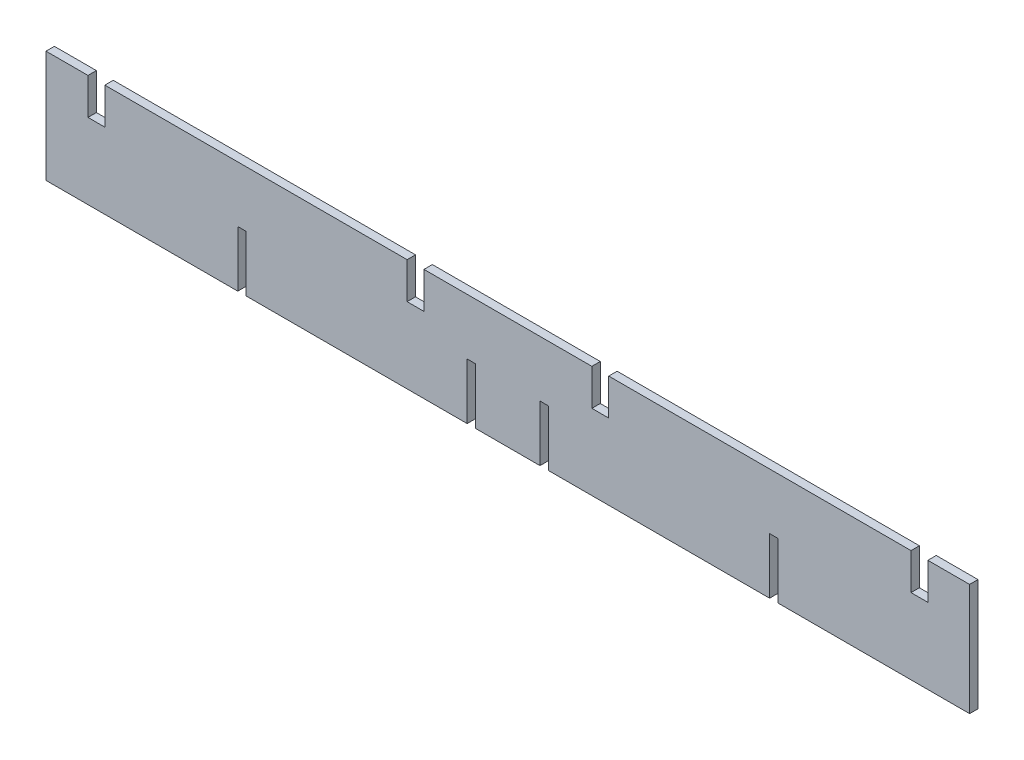
ISO-10303-21;
HEADER;
FILE_DESCRIPTION(('STEP AP214'),'2;1');
FILE_NAME('part.step','',(''),(''),'','','');
FILE_SCHEMA(('AUTOMOTIVE_DESIGN { 1 0 10303 214 1 1 1 1 }'));
ENDSEC;
DATA;
#1=APPLICATION_CONTEXT('core data for automotive mechanical design processes');
#2=APPLICATION_PROTOCOL_DEFINITION('international standard','automotive_design',2000,#1);
#3=PRODUCT_CONTEXT('',#1,'mechanical');
#4=PRODUCT('Part','Part','',(#3));
#5=PRODUCT_RELATED_PRODUCT_CATEGORY('part','',(#4));
#6=PRODUCT_DEFINITION_FORMATION('','',#4);
#7=PRODUCT_DEFINITION_CONTEXT('part definition',#1,'design');
#8=PRODUCT_DEFINITION('design','',#6,#7);
#9=PRODUCT_DEFINITION_SHAPE('','',#8);
#10=(LENGTH_UNIT() NAMED_UNIT(*) SI_UNIT(.MILLI.,.METRE.));
#11=(NAMED_UNIT(*) PLANE_ANGLE_UNIT() SI_UNIT($,.RADIAN.));
#12=(NAMED_UNIT(*) SI_UNIT($,.STERADIAN.) SOLID_ANGLE_UNIT());
#13=UNCERTAINTY_MEASURE_WITH_UNIT(LENGTH_MEASURE(1.E-05),#10,'distance_accuracy_value','');
#14=(GEOMETRIC_REPRESENTATION_CONTEXT(3) GLOBAL_UNCERTAINTY_ASSIGNED_CONTEXT((#13)) GLOBAL_UNIT_ASSIGNED_CONTEXT((#10,
#11,#12)) REPRESENTATION_CONTEXT('',''));
#15=CARTESIAN_POINT('',(0.,0.,0.));
#16=DIRECTION('',(0.,0.,1.));
#17=DIRECTION('',(1.,0.,0.));
#18=AXIS2_PLACEMENT_3D('',#15,#16,#17);
#19=CARTESIAN_POINT('',(-330.,-40.,6.));
#20=DIRECTION('',(0.,1.,0.));
#21=DIRECTION('',(0.,0.,1.));
#22=AXIS2_PLACEMENT_3D('',#19,#20,#21);
#23=PLANE('',#22);
#24=DIRECTION('',(1.,0.,0.));
#25=VECTOR('',#24,1.);
#26=CARTESIAN_POINT('',(-330.,-40.,6.));
#27=LINE('',#26,#25);
#28=CARTESIAN_POINT('',(193.12,-40.,6.));
#29=VERTEX_POINT('',#28);
#30=CARTESIAN_POINT('',(330.,-40.,6.));
#31=VERTEX_POINT('',#30);
#32=EDGE_CURVE('E495',#29,#31,#27,.T.);
#33=ORIENTED_EDGE('',*,*,#32,.F.);
#34=DIRECTION('',(0.,0.,1.));
#35=VECTOR('',#34,1.);
#36=CARTESIAN_POINT('',(193.12,-40.,0.));
#37=LINE('',#36,#35);
#38=CARTESIAN_POINT('',(193.12,-40.,0.));
#39=VERTEX_POINT('',#38);
#40=EDGE_CURVE('E296',#39,#29,#37,.T.);
#41=ORIENTED_EDGE('',*,*,#40,.F.);
#42=DIRECTION('',(1.,0.,0.));
#43=VECTOR('',#42,1.);
#44=CARTESIAN_POINT('',(-330.,-40.,0.));
#45=LINE('',#44,#43);
#46=CARTESIAN_POINT('',(330.,-40.,0.));
#47=VERTEX_POINT('',#46);
#48=EDGE_CURVE('E511',#39,#47,#45,.T.);
#49=ORIENTED_EDGE('',*,*,#48,.T.);
#50=DIRECTION('',(0.,0.,-1.));
#51=VECTOR('',#50,1.);
#52=CARTESIAN_POINT('',(330.,-40.,6.));
#53=LINE('',#52,#51);
#54=EDGE_CURVE('E499',#31,#47,#53,.T.);
#55=ORIENTED_EDGE('',*,*,#54,.F.);
#56=EDGE_LOOP('',(#33,#41,#49,#55));
#57=FACE_BOUND('',#56,.T.);
#58=ADVANCED_FACE('F35',(#57),#23,.F.);
#59=CARTESIAN_POINT('',(-186.92,-40.,6.));
#60=VERTEX_POINT('',#59);
#61=CARTESIAN_POINT('',(-29.04,-40.,6.));
#62=VERTEX_POINT('',#61);
#63=EDGE_CURVE('E500',#60,#62,#27,.T.);
#64=ORIENTED_EDGE('',*,*,#63,.F.);
#65=DIRECTION('',(0.,0.,1.));
#66=VECTOR('',#65,1.);
#67=CARTESIAN_POINT('',(-186.92,-40.,0.));
#68=LINE('',#67,#66);
#69=CARTESIAN_POINT('',(-186.92,-40.,0.));
#70=VERTEX_POINT('',#69);
#71=EDGE_CURVE('E298',#70,#60,#68,.T.);
#72=ORIENTED_EDGE('',*,*,#71,.F.);
#73=CARTESIAN_POINT('',(-29.04,-40.,0.));
#74=VERTEX_POINT('',#73);
#75=EDGE_CURVE('E288',#70,#74,#45,.T.);
#76=ORIENTED_EDGE('',*,*,#75,.T.);
#77=DIRECTION('',(0.,0.,1.));
#78=VECTOR('',#77,1.);
#79=CARTESIAN_POINT('',(-29.04,-40.,0.));
#80=LINE('',#79,#78);
#81=EDGE_CURVE('E350',#74,#62,#80,.T.);
#82=ORIENTED_EDGE('',*,*,#81,.T.);
#83=EDGE_LOOP('',(#64,#72,#76,#82));
#84=FACE_BOUND('',#83,.T.);
#85=ADVANCED_FACE('F605',(#84),#23,.F.);
#86=CARTESIAN_POINT('',(-23.,-40.,6.));
#87=VERTEX_POINT('',#86);
#88=CARTESIAN_POINT('',(23.,-40.,6.));
#89=VERTEX_POINT('',#88);
#90=EDGE_CURVE('E501',#87,#89,#27,.T.);
#91=ORIENTED_EDGE('',*,*,#90,.F.);
#92=DIRECTION('',(0.,0.,1.));
#93=VECTOR('',#92,1.);
#94=CARTESIAN_POINT('',(-23.,-40.,0.));
#95=LINE('',#94,#93);
#96=CARTESIAN_POINT('',(-23.,-40.,0.));
#97=VERTEX_POINT('',#96);
#98=EDGE_CURVE('E347',#97,#87,#95,.T.);
#99=ORIENTED_EDGE('',*,*,#98,.F.);
#100=CARTESIAN_POINT('',(23.,-40.,0.));
#101=VERTEX_POINT('',#100);
#102=EDGE_CURVE('E514',#97,#101,#45,.T.);
#103=ORIENTED_EDGE('',*,*,#102,.T.);
#104=DIRECTION('',(0.,0.,1.));
#105=VECTOR('',#104,1.);
#106=CARTESIAN_POINT('',(23.,-40.,0.));
#107=LINE('',#106,#105);
#108=EDGE_CURVE('E374',#101,#89,#107,.T.);
#109=ORIENTED_EDGE('',*,*,#108,.T.);
#110=EDGE_LOOP('',(#91,#99,#103,#109));
#111=FACE_BOUND('',#110,.T.);
#112=ADVANCED_FACE('F611',(#111),#23,.F.);
#113=CARTESIAN_POINT('',(29.04,-40.,0.));
#114=VERTEX_POINT('',#113);
#115=CARTESIAN_POINT('',(187.08,-40.,0.));
#116=VERTEX_POINT('',#115);
#117=EDGE_CURVE('E630',#114,#116,#45,.T.);
#118=ORIENTED_EDGE('',*,*,#117,.T.);
#119=DIRECTION('',(0.,0.,1.));
#120=VECTOR('',#119,1.);
#121=CARTESIAN_POINT('',(187.08,-40.,0.));
#122=LINE('',#121,#120);
#123=CARTESIAN_POINT('',(187.08,-40.,6.));
#124=VERTEX_POINT('',#123);
#125=EDGE_CURVE('E322',#116,#124,#122,.T.);
#126=ORIENTED_EDGE('',*,*,#125,.T.);
#127=CARTESIAN_POINT('',(29.04,-40.,6.));
#128=VERTEX_POINT('',#127);
#129=EDGE_CURVE('E647',#128,#124,#27,.T.);
#130=ORIENTED_EDGE('',*,*,#129,.F.);
#131=DIRECTION('',(0.,0.,1.));
#132=VECTOR('',#131,1.);
#133=CARTESIAN_POINT('',(29.04,-40.,0.));
#134=LINE('',#133,#132);
#135=EDGE_CURVE('E342',#114,#128,#134,.T.);
#136=ORIENTED_EDGE('',*,*,#135,.F.);
#137=EDGE_LOOP('',(#118,#126,#130,#136));
#138=FACE_BOUND('',#137,.T.);
#139=ADVANCED_FACE('F601',(#138),#23,.F.);
#140=CARTESIAN_POINT('',(-330.,40.,6.));
#141=DIRECTION('',(0.,-1.,0.));
#142=DIRECTION('',(0.,0.,-1.));
#143=AXIS2_PLACEMENT_3D('',#140,#141,#142);
#144=PLANE('',#143);
#145=DIRECTION('',(-1.,0.,0.));
#146=VECTOR('',#145,1.);
#147=CARTESIAN_POINT('',(-330.,40.,0.));
#148=LINE('',#147,#146);
#149=CARTESIAN_POINT('',(-71.9600000000001,40.,0.));
#150=VERTEX_POINT('',#149);
#151=CARTESIAN_POINT('',(-287.96,40.,0.));
#152=VERTEX_POINT('',#151);
#153=EDGE_CURVE('E586',#150,#152,#148,.T.);
#154=ORIENTED_EDGE('',*,*,#153,.T.);
#155=DIRECTION('',(0.,0.,1.));
#156=VECTOR('',#155,1.);
#157=CARTESIAN_POINT('',(-287.96,40.,0.));
#158=LINE('',#157,#156);
#159=CARTESIAN_POINT('',(-287.96,40.,6.));
#160=VERTEX_POINT('',#159);
#161=EDGE_CURVE('E399',#152,#160,#158,.T.);
#162=ORIENTED_EDGE('',*,*,#161,.T.);
#163=DIRECTION('',(-1.,0.,0.));
#164=VECTOR('',#163,1.);
#165=CARTESIAN_POINT('',(-330.,40.,6.));
#166=LINE('',#165,#164);
#167=CARTESIAN_POINT('',(-71.9600000000001,40.,6.));
#168=VERTEX_POINT('',#167);
#169=EDGE_CURVE('E539',#168,#160,#166,.T.);
#170=ORIENTED_EDGE('',*,*,#169,.F.);
#171=DIRECTION('',(0.,0.,1.));
#172=VECTOR('',#171,1.);
#173=CARTESIAN_POINT('',(-71.9600000000001,40.,0.));
#174=LINE('',#173,#172);
#175=EDGE_CURVE('E395',#150,#168,#174,.T.);
#176=ORIENTED_EDGE('',*,*,#175,.F.);
#177=EDGE_LOOP('',(#154,#162,#170,#176));
#178=FACE_BOUND('',#177,.T.);
#179=ADVANCED_FACE('F585',(#178),#144,.F.);
#180=CARTESIAN_POINT('',(-300.,40.,6.));
#181=VERTEX_POINT('',#180);
#182=CARTESIAN_POINT('',(-330.,40.,6.));
#183=VERTEX_POINT('',#182);
#184=EDGE_CURVE('E487',#181,#183,#166,.T.);
#185=ORIENTED_EDGE('',*,*,#184,.F.);
#186=DIRECTION('',(0.,0.,1.));
#187=VECTOR('',#186,1.);
#188=CARTESIAN_POINT('',(-300.,40.,0.));
#189=LINE('',#188,#187);
#190=CARTESIAN_POINT('',(-300.,40.,0.));
#191=VERTEX_POINT('',#190);
#192=EDGE_CURVE('E390',#191,#181,#189,.T.);
#193=ORIENTED_EDGE('',*,*,#192,.F.);
#194=CARTESIAN_POINT('',(-330.,40.,0.));
#195=VERTEX_POINT('',#194);
#196=EDGE_CURVE('E504',#191,#195,#148,.T.);
#197=ORIENTED_EDGE('',*,*,#196,.T.);
#198=DIRECTION('',(0.,0.,-1.));
#199=VECTOR('',#198,1.);
#200=CARTESIAN_POINT('',(-330.,40.,6.));
#201=LINE('',#200,#199);
#202=EDGE_CURVE('E43',#183,#195,#201,.T.);
#203=ORIENTED_EDGE('',*,*,#202,.F.);
#204=EDGE_LOOP('',(#185,#193,#197,#203));
#205=FACE_BOUND('',#204,.T.);
#206=ADVANCED_FACE('F595',(#205),#144,.F.);
#207=CARTESIAN_POINT('',(60.0799999999999,40.,0.));
#208=VERTEX_POINT('',#207);
#209=CARTESIAN_POINT('',(-59.9200000000001,40.,0.));
#210=VERTEX_POINT('',#209);
#211=EDGE_CURVE('E572',#208,#210,#148,.T.);
#212=ORIENTED_EDGE('',*,*,#211,.T.);
#213=DIRECTION('',(0.,0.,1.));
#214=VECTOR('',#213,1.);
#215=CARTESIAN_POINT('',(-59.9200000000001,40.,0.));
#216=LINE('',#215,#214);
#217=CARTESIAN_POINT('',(-59.9200000000001,40.,6.));
#218=VERTEX_POINT('',#217);
#219=EDGE_CURVE('E428',#210,#218,#216,.T.);
#220=ORIENTED_EDGE('',*,*,#219,.T.);
#221=CARTESIAN_POINT('',(60.0799999999999,40.,6.));
#222=VERTEX_POINT('',#221);
#223=EDGE_CURVE('E541',#222,#218,#166,.T.);
#224=ORIENTED_EDGE('',*,*,#223,.F.);
#225=DIRECTION('',(0.,0.,1.));
#226=VECTOR('',#225,1.);
#227=CARTESIAN_POINT('',(60.0799999999999,40.,0.));
#228=LINE('',#227,#226);
#229=EDGE_CURVE('E423',#208,#222,#228,.T.);
#230=ORIENTED_EDGE('',*,*,#229,.F.);
#231=EDGE_LOOP('',(#212,#220,#224,#230));
#232=FACE_BOUND('',#231,.T.);
#233=ADVANCED_FACE('F571',(#232),#144,.F.);
#234=CARTESIAN_POINT('',(288.12,40.,0.));
#235=VERTEX_POINT('',#234);
#236=CARTESIAN_POINT('',(72.1199999999999,40.,0.));
#237=VERTEX_POINT('',#236);
#238=EDGE_CURVE('E509',#235,#237,#148,.T.);
#239=ORIENTED_EDGE('',*,*,#238,.T.);
#240=DIRECTION('',(0.,0.,1.));
#241=VECTOR('',#240,1.);
#242=CARTESIAN_POINT('',(72.1199999999999,40.,0.));
#243=LINE('',#242,#241);
#244=CARTESIAN_POINT('',(72.1199999999999,40.,6.));
#245=VERTEX_POINT('',#244);
#246=EDGE_CURVE('E454',#237,#245,#243,.T.);
#247=ORIENTED_EDGE('',*,*,#246,.T.);
#248=CARTESIAN_POINT('',(288.12,40.,6.));
#249=VERTEX_POINT('',#248);
#250=EDGE_CURVE('E493',#249,#245,#166,.T.);
#251=ORIENTED_EDGE('',*,*,#250,.F.);
#252=DIRECTION('',(0.,0.,1.));
#253=VECTOR('',#252,1.);
#254=CARTESIAN_POINT('',(288.12,40.,0.));
#255=LINE('',#254,#253);
#256=EDGE_CURVE('E449',#235,#249,#255,.T.);
#257=ORIENTED_EDGE('',*,*,#256,.F.);
#258=EDGE_LOOP('',(#239,#247,#251,#257));
#259=FACE_BOUND('',#258,.T.);
#260=ADVANCED_FACE('F558',(#259),#144,.F.);
#261=CARTESIAN_POINT('',(330.,40.,6.));
#262=DIRECTION('',(-1.,0.,0.));
#263=DIRECTION('',(0.,0.,1.));
#264=AXIS2_PLACEMENT_3D('',#261,#262,#263);
#265=PLANE('',#264);
#266=DIRECTION('',(0.,1.,0.));
#267=VECTOR('',#266,1.);
#268=CARTESIAN_POINT('',(330.,40.,0.));
#269=LINE('',#268,#267);
#270=CARTESIAN_POINT('',(330.,40.,0.));
#271=VERTEX_POINT('',#270);
#272=EDGE_CURVE('E402',#47,#271,#269,.T.);
#273=ORIENTED_EDGE('',*,*,#272,.T.);
#274=DIRECTION('',(0.,0.,-1.));
#275=VECTOR('',#274,1.);
#276=CARTESIAN_POINT('',(330.,40.,6.));
#277=LINE('',#276,#275);
#278=CARTESIAN_POINT('',(330.,40.,6.));
#279=VERTEX_POINT('',#278);
#280=EDGE_CURVE('E11',#279,#271,#277,.T.);
#281=ORIENTED_EDGE('',*,*,#280,.F.);
#282=DIRECTION('',(0.,1.,0.));
#283=VECTOR('',#282,1.);
#284=CARTESIAN_POINT('',(330.,40.,6.));
#285=LINE('',#284,#283);
#286=EDGE_CURVE('E484',#31,#279,#285,.T.);
#287=ORIENTED_EDGE('',*,*,#286,.F.);
#288=ORIENTED_EDGE('',*,*,#54,.T.);
#289=EDGE_LOOP('',(#273,#281,#287,#288));
#290=FACE_BOUND('',#289,.T.);
#291=ADVANCED_FACE('F37',(#290),#265,.F.);
#292=CARTESIAN_POINT('',(300.16,40.,0.));
#293=VERTEX_POINT('',#292);
#294=EDGE_CURVE('E505',#271,#293,#148,.T.);
#295=ORIENTED_EDGE('',*,*,#294,.T.);
#296=DIRECTION('',(0.,0.,1.));
#297=VECTOR('',#296,1.);
#298=CARTESIAN_POINT('',(300.16,40.,0.));
#299=LINE('',#298,#297);
#300=CARTESIAN_POINT('',(300.16,40.,6.));
#301=VERTEX_POINT('',#300);
#302=EDGE_CURVE('E478',#293,#301,#299,.T.);
#303=ORIENTED_EDGE('',*,*,#302,.T.);
#304=EDGE_CURVE('E489',#279,#301,#166,.T.);
#305=ORIENTED_EDGE('',*,*,#304,.F.);
#306=ORIENTED_EDGE('',*,*,#280,.T.);
#307=EDGE_LOOP('',(#295,#303,#305,#306));
#308=FACE_BOUND('',#307,.T.);
#309=ADVANCED_FACE('F602',(#308),#144,.F.);
#310=CARTESIAN_POINT('',(-330.,40.,6.));
#311=DIRECTION('',(1.,0.,0.));
#312=DIRECTION('',(0.,0.,-1.));
#313=AXIS2_PLACEMENT_3D('',#310,#311,#312);
#314=PLANE('',#313);
#315=DIRECTION('',(0.,-1.,0.));
#316=VECTOR('',#315,1.);
#317=CARTESIAN_POINT('',(-330.,40.,0.));
#318=LINE('',#317,#316);
#319=CARTESIAN_POINT('',(-330.,-40.,0.));
#320=VERTEX_POINT('',#319);
#321=EDGE_CURVE('E508',#195,#320,#318,.T.);
#322=ORIENTED_EDGE('',*,*,#321,.T.);
#323=DIRECTION('',(0.,0.,-1.));
#324=VECTOR('',#323,1.);
#325=CARTESIAN_POINT('',(-330.,-40.,6.));
#326=LINE('',#325,#324);
#327=CARTESIAN_POINT('',(-330.,-40.,6.));
#328=VERTEX_POINT('',#327);
#329=EDGE_CURVE('E517',#328,#320,#326,.T.);
#330=ORIENTED_EDGE('',*,*,#329,.F.);
#331=DIRECTION('',(0.,-1.,0.));
#332=VECTOR('',#331,1.);
#333=CARTESIAN_POINT('',(-330.,40.,6.));
#334=LINE('',#333,#332);
#335=EDGE_CURVE('E492',#183,#328,#334,.T.);
#336=ORIENTED_EDGE('',*,*,#335,.F.);
#337=ORIENTED_EDGE('',*,*,#202,.T.);
#338=EDGE_LOOP('',(#322,#330,#336,#337));
#339=FACE_BOUND('',#338,.T.);
#340=ADVANCED_FACE('F524',(#339),#314,.F.);
#341=CARTESIAN_POINT('',(-192.96,-40.,0.));
#342=VERTEX_POINT('',#341);
#343=EDGE_CURVE('E488',#320,#342,#45,.T.);
#344=ORIENTED_EDGE('',*,*,#343,.T.);
#345=DIRECTION('',(0.,0.,1.));
#346=VECTOR('',#345,1.);
#347=CARTESIAN_POINT('',(-192.96,-40.,0.));
#348=LINE('',#347,#346);
#349=CARTESIAN_POINT('',(-192.96,-40.,6.));
#350=VERTEX_POINT('',#349);
#351=EDGE_CURVE('E301',#342,#350,#348,.T.);
#352=ORIENTED_EDGE('',*,*,#351,.T.);
#353=EDGE_CURVE('E496',#328,#350,#27,.T.);
#354=ORIENTED_EDGE('',*,*,#353,.F.);
#355=ORIENTED_EDGE('',*,*,#329,.T.);
#356=EDGE_LOOP('',(#344,#352,#354,#355));
#357=FACE_BOUND('',#356,.T.);
#358=ADVANCED_FACE('F531',(#357),#23,.F.);
#359=CARTESIAN_POINT('',(0.,0.,6.));
#360=DIRECTION('',(0.,0.,1.));
#361=DIRECTION('',(1.,0.,0.));
#362=AXIS2_PLACEMENT_3D('',#359,#360,#361);
#363=PLANE('',#362);
#364=DIRECTION('',(0.,1.,0.));
#365=VECTOR('',#364,1.);
#366=CARTESIAN_POINT('',(-186.92,-40.,6.));
#367=LINE('',#366,#365);
#368=CARTESIAN_POINT('',(-186.92,0.,6.));
#369=VERTEX_POINT('',#368);
#370=EDGE_CURVE('E274',#60,#369,#367,.T.);
#371=ORIENTED_EDGE('',*,*,#370,.F.);
#372=ORIENTED_EDGE('',*,*,#63,.T.);
#373=DIRECTION('',(0.,-1.,0.));
#374=VECTOR('',#373,1.);
#375=CARTESIAN_POINT('',(-29.04,0.,6.));
#376=LINE('',#375,#374);
#377=CARTESIAN_POINT('',(-29.04,0.,6.));
#378=VERTEX_POINT('',#377);
#379=EDGE_CURVE('E332',#378,#62,#376,.T.);
#380=ORIENTED_EDGE('',*,*,#379,.F.);
#381=DIRECTION('',(-1.,0.,0.));
#382=VECTOR('',#381,1.);
#383=CARTESIAN_POINT('',(-29.04,0.,6.));
#384=LINE('',#383,#382);
#385=CARTESIAN_POINT('',(-23.,0.,6.));
#386=VERTEX_POINT('',#385);
#387=EDGE_CURVE('E341',#386,#378,#384,.T.);
#388=ORIENTED_EDGE('',*,*,#387,.F.);
#389=DIRECTION('',(0.,1.,0.));
#390=VECTOR('',#389,1.);
#391=CARTESIAN_POINT('',(-23.,-40.,6.));
#392=LINE('',#391,#390);
#393=EDGE_CURVE('E338',#87,#386,#392,.T.);
#394=ORIENTED_EDGE('',*,*,#393,.F.);
#395=ORIENTED_EDGE('',*,*,#90,.T.);
#396=DIRECTION('',(0.,-1.,0.));
#397=VECTOR('',#396,1.);
#398=CARTESIAN_POINT('',(23.,0.,6.));
#399=LINE('',#398,#397);
#400=CARTESIAN_POINT('',(23.,0.,6.));
#401=VERTEX_POINT('',#400);
#402=EDGE_CURVE('E360',#401,#89,#399,.T.);
#403=ORIENTED_EDGE('',*,*,#402,.F.);
#404=DIRECTION('',(-1.,0.,0.));
#405=VECTOR('',#404,1.);
#406=CARTESIAN_POINT('',(23.,0.,6.));
#407=LINE('',#406,#405);
#408=CARTESIAN_POINT('',(29.04,0.,6.));
#409=VERTEX_POINT('',#408);
#410=EDGE_CURVE('E369',#409,#401,#407,.T.);
#411=ORIENTED_EDGE('',*,*,#410,.F.);
#412=DIRECTION('',(0.,1.,0.));
#413=VECTOR('',#412,1.);
#414=CARTESIAN_POINT('',(29.04,-40.,6.));
#415=LINE('',#414,#413);
#416=EDGE_CURVE('E300',#128,#409,#415,.T.);
#417=ORIENTED_EDGE('',*,*,#416,.F.);
#418=ORIENTED_EDGE('',*,*,#129,.T.);
#419=DIRECTION('',(0.,-1.,0.));
#420=VECTOR('',#419,1.);
#421=CARTESIAN_POINT('',(187.08,-40.,6.));
#422=LINE('',#421,#420);
#423=CARTESIAN_POINT('',(187.08,0.,6.));
#424=VERTEX_POINT('',#423);
#425=EDGE_CURVE('E309',#424,#124,#422,.T.);
#426=ORIENTED_EDGE('',*,*,#425,.F.);
#427=DIRECTION('',(-1.,0.,0.));
#428=VECTOR('',#427,1.);
#429=CARTESIAN_POINT('',(193.12,0.,6.));
#430=LINE('',#429,#428);
#431=CARTESIAN_POINT('',(193.12,0.,6.));
#432=VERTEX_POINT('',#431);
#433=EDGE_CURVE('E317',#432,#424,#430,.T.);
#434=ORIENTED_EDGE('',*,*,#433,.F.);
#435=DIRECTION('',(0.,1.,0.));
#436=VECTOR('',#435,1.);
#437=CARTESIAN_POINT('',(193.12,-40.,6.));
#438=LINE('',#437,#436);
#439=EDGE_CURVE('E314',#29,#432,#438,.T.);
#440=ORIENTED_EDGE('',*,*,#439,.F.);
#441=ORIENTED_EDGE('',*,*,#32,.T.);
#442=ORIENTED_EDGE('',*,*,#286,.T.);
#443=ORIENTED_EDGE('',*,*,#304,.T.);
#444=DIRECTION('',(0.,1.,0.));
#445=VECTOR('',#444,1.);
#446=CARTESIAN_POINT('',(300.16,40.,6.));
#447=LINE('',#446,#445);
#448=CARTESIAN_POINT('',(300.16,14.,6.));
#449=VERTEX_POINT('',#448);
#450=EDGE_CURVE('E464',#449,#301,#447,.T.);
#451=ORIENTED_EDGE('',*,*,#450,.F.);
#452=DIRECTION('',(1.,0.,0.));
#453=VECTOR('',#452,1.);
#454=CARTESIAN_POINT('',(288.12,14.,6.));
#455=LINE('',#454,#453);
#456=CARTESIAN_POINT('',(288.12,14.,6.));
#457=VERTEX_POINT('',#456);
#458=EDGE_CURVE('E473',#457,#449,#455,.T.);
#459=ORIENTED_EDGE('',*,*,#458,.F.);
#460=DIRECTION('',(0.,-1.,0.));
#461=VECTOR('',#460,1.);
#462=CARTESIAN_POINT('',(288.12,40.,6.));
#463=LINE('',#462,#461);
#464=EDGE_CURVE('E349',#249,#457,#463,.T.);
#465=ORIENTED_EDGE('',*,*,#464,.F.);
#466=ORIENTED_EDGE('',*,*,#250,.T.);
#467=DIRECTION('',(0.,1.,0.));
#468=VECTOR('',#467,1.);
#469=CARTESIAN_POINT('',(72.1199999999999,40.,6.));
#470=LINE('',#469,#468);
#471=CARTESIAN_POINT('',(72.1199999999999,14.,6.));
#472=VERTEX_POINT('',#471);
#473=EDGE_CURVE('E438',#472,#245,#470,.T.);
#474=ORIENTED_EDGE('',*,*,#473,.F.);
#475=DIRECTION('',(1.,0.,0.));
#476=VECTOR('',#475,1.);
#477=CARTESIAN_POINT('',(60.0799999999999,14.,6.));
#478=LINE('',#477,#476);
#479=CARTESIAN_POINT('',(60.0799999999999,14.,6.));
#480=VERTEX_POINT('',#479);
#481=EDGE_CURVE('E448',#480,#472,#478,.T.);
#482=ORIENTED_EDGE('',*,*,#481,.F.);
#483=DIRECTION('',(0.,-1.,0.));
#484=VECTOR('',#483,1.);
#485=CARTESIAN_POINT('',(60.0799999999999,40.,6.));
#486=LINE('',#485,#484);
#487=EDGE_CURVE('E445',#222,#480,#486,.T.);
#488=ORIENTED_EDGE('',*,*,#487,.F.);
#489=ORIENTED_EDGE('',*,*,#223,.T.);
#490=DIRECTION('',(0.,1.,0.));
#491=VECTOR('',#490,1.);
#492=CARTESIAN_POINT('',(-59.9200000000001,40.,6.));
#493=LINE('',#492,#491);
#494=CARTESIAN_POINT('',(-59.9200000000001,14.,6.));
#495=VERTEX_POINT('',#494);
#496=EDGE_CURVE('E412',#495,#218,#493,.T.);
#497=ORIENTED_EDGE('',*,*,#496,.F.);
#498=DIRECTION('',(1.,0.,0.));
#499=VECTOR('',#498,1.);
#500=CARTESIAN_POINT('',(-71.9600000000001,14.,6.));
#501=LINE('',#500,#499);
#502=CARTESIAN_POINT('',(-71.9600000000001,14.,6.));
#503=VERTEX_POINT('',#502);
#504=EDGE_CURVE('E422',#503,#495,#501,.T.);
#505=ORIENTED_EDGE('',*,*,#504,.F.);
#506=DIRECTION('',(0.,-1.,0.));
#507=VECTOR('',#506,1.);
#508=CARTESIAN_POINT('',(-71.9600000000001,40.,6.));
#509=LINE('',#508,#507);
#510=EDGE_CURVE('E419',#168,#503,#509,.T.);
#511=ORIENTED_EDGE('',*,*,#510,.F.);
#512=ORIENTED_EDGE('',*,*,#169,.T.);
#513=DIRECTION('',(0.,1.,0.));
#514=VECTOR('',#513,1.);
#515=CARTESIAN_POINT('',(-287.96,14.,6.));
#516=LINE('',#515,#514);
#517=CARTESIAN_POINT('',(-287.96,14.,6.));
#518=VERTEX_POINT('',#517);
#519=EDGE_CURVE('E384',#518,#160,#516,.T.);
#520=ORIENTED_EDGE('',*,*,#519,.F.);
#521=DIRECTION('',(1.,0.,0.));
#522=VECTOR('',#521,1.);
#523=CARTESIAN_POINT('',(-300.,14.,6.));
#524=LINE('',#523,#522);
#525=CARTESIAN_POINT('',(-300.,14.,6.));
#526=VERTEX_POINT('',#525);
#527=EDGE_CURVE('E394',#526,#518,#524,.T.);
#528=ORIENTED_EDGE('',*,*,#527,.F.);
#529=DIRECTION('',(0.,-1.,0.));
#530=VECTOR('',#529,1.);
#531=CARTESIAN_POINT('',(-300.,40.,6.));
#532=LINE('',#531,#530);
#533=EDGE_CURVE('E391',#181,#526,#532,.T.);
#534=ORIENTED_EDGE('',*,*,#533,.F.);
#535=ORIENTED_EDGE('',*,*,#184,.T.);
#536=ORIENTED_EDGE('',*,*,#335,.T.);
#537=ORIENTED_EDGE('',*,*,#353,.T.);
#538=DIRECTION('',(0.,-1.,0.));
#539=VECTOR('',#538,1.);
#540=CARTESIAN_POINT('',(-192.96,-40.,6.));
#541=LINE('',#540,#539);
#542=CARTESIAN_POINT('',(-192.96,0.,6.));
#543=VERTEX_POINT('',#542);
#544=EDGE_CURVE('E289',#543,#350,#541,.T.);
#545=ORIENTED_EDGE('',*,*,#544,.F.);
#546=DIRECTION('',(-1.,0.,0.));
#547=VECTOR('',#546,1.);
#548=CARTESIAN_POINT('',(-186.92,0.,6.));
#549=LINE('',#548,#547);
#550=EDGE_CURVE('E291',#369,#543,#549,.T.);
#551=ORIENTED_EDGE('',*,*,#550,.F.);
#552=EDGE_LOOP('',(#371,#372,#380,#388,#394,#395,#403,#411,#417,#418,#426,#434,#440,#441,#442,
#443,#451,#459,#465,#466,#474,#482,#488,#489,#497,#505,#511,#512,#520,#528,#534,#535,#536,#537,
#545,#551));
#553=FACE_BOUND('',#552,.T.);
#554=ADVANCED_FACE('F535',(#553),#363,.T.);
#555=CARTESIAN_POINT('',(0.,0.,0.));
#556=DIRECTION('',(0.,0.,1.));
#557=DIRECTION('',(1.,0.,0.));
#558=AXIS2_PLACEMENT_3D('',#555,#556,#557);
#559=PLANE('',#558);
#560=ORIENTED_EDGE('',*,*,#75,.F.);
#561=DIRECTION('',(0.,1.,0.));
#562=VECTOR('',#561,1.);
#563=CARTESIAN_POINT('',(-186.92,-40.,0.));
#564=LINE('',#563,#562);
#565=CARTESIAN_POINT('',(-186.92,0.,0.));
#566=VERTEX_POINT('',#565);
#567=EDGE_CURVE('E271',#70,#566,#564,.T.);
#568=ORIENTED_EDGE('',*,*,#567,.T.);
#569=DIRECTION('',(-1.,0.,0.));
#570=VECTOR('',#569,1.);
#571=CARTESIAN_POINT('',(-186.92,0.,0.));
#572=LINE('',#571,#570);
#573=CARTESIAN_POINT('',(-192.96,0.,0.));
#574=VERTEX_POINT('',#573);
#575=EDGE_CURVE('E281',#566,#574,#572,.T.);
#576=ORIENTED_EDGE('',*,*,#575,.T.);
#577=DIRECTION('',(0.,-1.,0.));
#578=VECTOR('',#577,1.);
#579=CARTESIAN_POINT('',(-192.96,-40.,0.));
#580=LINE('',#579,#578);
#581=EDGE_CURVE('E50',#574,#342,#580,.T.);
#582=ORIENTED_EDGE('',*,*,#581,.T.);
#583=ORIENTED_EDGE('',*,*,#343,.F.);
#584=ORIENTED_EDGE('',*,*,#321,.F.);
#585=ORIENTED_EDGE('',*,*,#196,.F.);
#586=DIRECTION('',(0.,-1.,0.));
#587=VECTOR('',#586,1.);
#588=CARTESIAN_POINT('',(-300.,40.,0.));
#589=LINE('',#588,#587);
#590=CARTESIAN_POINT('',(-300.,14.,0.));
#591=VERTEX_POINT('',#590);
#592=EDGE_CURVE('E380',#191,#591,#589,.T.);
#593=ORIENTED_EDGE('',*,*,#592,.T.);
#594=DIRECTION('',(1.,0.,0.));
#595=VECTOR('',#594,1.);
#596=CARTESIAN_POINT('',(-300.,14.,0.));
#597=LINE('',#596,#595);
#598=CARTESIAN_POINT('',(-287.96,14.,0.));
#599=VERTEX_POINT('',#598);
#600=EDGE_CURVE('E383',#591,#599,#597,.T.);
#601=ORIENTED_EDGE('',*,*,#600,.T.);
#602=DIRECTION('',(0.,1.,0.));
#603=VECTOR('',#602,1.);
#604=CARTESIAN_POINT('',(-287.96,14.,0.));
#605=LINE('',#604,#603);
#606=EDGE_CURVE('E387',#599,#152,#605,.T.);
#607=ORIENTED_EDGE('',*,*,#606,.T.);
#608=ORIENTED_EDGE('',*,*,#153,.F.);
#609=DIRECTION('',(0.,-1.,0.));
#610=VECTOR('',#609,1.);
#611=CARTESIAN_POINT('',(-71.9600000000001,40.,0.));
#612=LINE('',#611,#610);
#613=CARTESIAN_POINT('',(-71.9600000000001,14.,0.));
#614=VERTEX_POINT('',#613);
#615=EDGE_CURVE('E408',#150,#614,#612,.T.);
#616=ORIENTED_EDGE('',*,*,#615,.T.);
#617=DIRECTION('',(1.,0.,0.));
#618=VECTOR('',#617,1.);
#619=CARTESIAN_POINT('',(-71.9600000000001,14.,0.));
#620=LINE('',#619,#618);
#621=CARTESIAN_POINT('',(-59.9200000000001,14.,0.));
#622=VERTEX_POINT('',#621);
#623=EDGE_CURVE('E411',#614,#622,#620,.T.);
#624=ORIENTED_EDGE('',*,*,#623,.T.);
#625=DIRECTION('',(0.,1.,0.));
#626=VECTOR('',#625,1.);
#627=CARTESIAN_POINT('',(-59.9200000000001,40.,0.));
#628=LINE('',#627,#626);
#629=EDGE_CURVE('E415',#622,#210,#628,.T.);
#630=ORIENTED_EDGE('',*,*,#629,.T.);
#631=ORIENTED_EDGE('',*,*,#211,.F.);
#632=DIRECTION('',(0.,-1.,0.));
#633=VECTOR('',#632,1.);
#634=CARTESIAN_POINT('',(60.0799999999999,40.,0.));
#635=LINE('',#634,#633);
#636=CARTESIAN_POINT('',(60.0799999999999,14.,0.));
#637=VERTEX_POINT('',#636);
#638=EDGE_CURVE('E434',#208,#637,#635,.T.);
#639=ORIENTED_EDGE('',*,*,#638,.T.);
#640=DIRECTION('',(1.,0.,0.));
#641=VECTOR('',#640,1.);
#642=CARTESIAN_POINT('',(60.0799999999999,14.,0.));
#643=LINE('',#642,#641);
#644=CARTESIAN_POINT('',(72.1199999999999,14.,0.));
#645=VERTEX_POINT('',#644);
#646=EDGE_CURVE('E437',#637,#645,#643,.T.);
#647=ORIENTED_EDGE('',*,*,#646,.T.);
#648=DIRECTION('',(0.,1.,0.));
#649=VECTOR('',#648,1.);
#650=CARTESIAN_POINT('',(72.1199999999999,40.,0.));
#651=LINE('',#650,#649);
#652=EDGE_CURVE('E441',#645,#237,#651,.T.);
#653=ORIENTED_EDGE('',*,*,#652,.T.);
#654=ORIENTED_EDGE('',*,*,#238,.F.);
#655=DIRECTION('',(0.,-1.,0.));
#656=VECTOR('',#655,1.);
#657=CARTESIAN_POINT('',(288.12,40.,0.));
#658=LINE('',#657,#656);
#659=CARTESIAN_POINT('',(288.12,14.,0.));
#660=VERTEX_POINT('',#659);
#661=EDGE_CURVE('E460',#235,#660,#658,.T.);
#662=ORIENTED_EDGE('',*,*,#661,.T.);
#663=DIRECTION('',(1.,0.,0.));
#664=VECTOR('',#663,1.);
#665=CARTESIAN_POINT('',(288.12,14.,0.));
#666=LINE('',#665,#664);
#667=CARTESIAN_POINT('',(300.16,14.,0.));
#668=VERTEX_POINT('',#667);
#669=EDGE_CURVE('E463',#660,#668,#666,.T.);
#670=ORIENTED_EDGE('',*,*,#669,.T.);
#671=DIRECTION('',(0.,1.,0.));
#672=VECTOR('',#671,1.);
#673=CARTESIAN_POINT('',(300.16,40.,0.));
#674=LINE('',#673,#672);
#675=EDGE_CURVE('E467',#668,#293,#674,.T.);
#676=ORIENTED_EDGE('',*,*,#675,.T.);
#677=ORIENTED_EDGE('',*,*,#294,.F.);
#678=ORIENTED_EDGE('',*,*,#272,.F.);
#679=ORIENTED_EDGE('',*,*,#48,.F.);
#680=DIRECTION('',(0.,1.,0.));
#681=VECTOR('',#680,1.);
#682=CARTESIAN_POINT('',(193.12,-40.,0.));
#683=LINE('',#682,#681);
#684=CARTESIAN_POINT('',(193.12,0.,0.));
#685=VERTEX_POINT('',#684);
#686=EDGE_CURVE('E305',#39,#685,#683,.T.);
#687=ORIENTED_EDGE('',*,*,#686,.T.);
#688=DIRECTION('',(-1.,0.,0.));
#689=VECTOR('',#688,1.);
#690=CARTESIAN_POINT('',(193.12,0.,0.));
#691=LINE('',#690,#689);
#692=CARTESIAN_POINT('',(187.08,0.,0.));
#693=VERTEX_POINT('',#692);
#694=EDGE_CURVE('E308',#685,#693,#691,.T.);
#695=ORIENTED_EDGE('',*,*,#694,.T.);
#696=DIRECTION('',(0.,-1.,0.));
#697=VECTOR('',#696,1.);
#698=CARTESIAN_POINT('',(187.08,-40.,0.));
#699=LINE('',#698,#697);
#700=EDGE_CURVE('E58',#693,#116,#699,.T.);
#701=ORIENTED_EDGE('',*,*,#700,.T.);
#702=ORIENTED_EDGE('',*,*,#117,.F.);
#703=DIRECTION('',(0.,1.,0.));
#704=VECTOR('',#703,1.);
#705=CARTESIAN_POINT('',(29.04,-40.,0.));
#706=LINE('',#705,#704);
#707=CARTESIAN_POINT('',(29.04,0.,0.));
#708=VERTEX_POINT('',#707);
#709=EDGE_CURVE('E356',#114,#708,#706,.T.);
#710=ORIENTED_EDGE('',*,*,#709,.T.);
#711=DIRECTION('',(-1.,0.,0.));
#712=VECTOR('',#711,1.);
#713=CARTESIAN_POINT('',(23.,0.,0.));
#714=LINE('',#713,#712);
#715=CARTESIAN_POINT('',(23.,0.,0.));
#716=VERTEX_POINT('',#715);
#717=EDGE_CURVE('E359',#708,#716,#714,.T.);
#718=ORIENTED_EDGE('',*,*,#717,.T.);
#719=DIRECTION('',(0.,-1.,0.));
#720=VECTOR('',#719,1.);
#721=CARTESIAN_POINT('',(23.,0.,0.));
#722=LINE('',#721,#720);
#723=EDGE_CURVE('E363',#716,#101,#722,.T.);
#724=ORIENTED_EDGE('',*,*,#723,.T.);
#725=ORIENTED_EDGE('',*,*,#102,.F.);
#726=DIRECTION('',(0.,1.,0.));
#727=VECTOR('',#726,1.);
#728=CARTESIAN_POINT('',(-23.,-40.,0.));
#729=LINE('',#728,#727);
#730=CARTESIAN_POINT('',(-23.,0.,0.));
#731=VERTEX_POINT('',#730);
#732=EDGE_CURVE('E328',#97,#731,#729,.T.);
#733=ORIENTED_EDGE('',*,*,#732,.T.);
#734=DIRECTION('',(-1.,0.,0.));
#735=VECTOR('',#734,1.);
#736=CARTESIAN_POINT('',(-29.04,0.,0.));
#737=LINE('',#736,#735);
#738=CARTESIAN_POINT('',(-29.04,0.,0.));
#739=VERTEX_POINT('',#738);
#740=EDGE_CURVE('E331',#731,#739,#737,.T.);
#741=ORIENTED_EDGE('',*,*,#740,.T.);
#742=DIRECTION('',(0.,-1.,0.));
#743=VECTOR('',#742,1.);
#744=CARTESIAN_POINT('',(-29.04,0.,0.));
#745=LINE('',#744,#743);
#746=EDGE_CURVE('E335',#739,#74,#745,.T.);
#747=ORIENTED_EDGE('',*,*,#746,.T.);
#748=EDGE_LOOP('',(#560,#568,#576,#582,#583,#584,#585,#593,#601,#607,#608,#616,#624,#630,#631,
#639,#647,#653,#654,#662,#670,#676,#677,#678,#679,#687,#695,#701,#702,#710,#718,#724,#725,#733,
#741,#747));
#749=FACE_BOUND('',#748,.T.);
#750=ADVANCED_FACE('F286',(#749),#559,.F.);
#751=CARTESIAN_POINT('',(288.12,40.,0.));
#752=DIRECTION('',(-1.,0.,0.));
#753=DIRECTION('',(0.,0.,1.));
#754=AXIS2_PLACEMENT_3D('',#751,#752,#753);
#755=PLANE('',#754);
#756=ORIENTED_EDGE('',*,*,#464,.T.);
#757=DIRECTION('',(0.,0.,1.));
#758=VECTOR('',#757,1.);
#759=CARTESIAN_POINT('',(288.12,14.,0.));
#760=LINE('',#759,#758);
#761=EDGE_CURVE('E470',#660,#457,#760,.T.);
#762=ORIENTED_EDGE('',*,*,#761,.F.);
#763=ORIENTED_EDGE('',*,*,#661,.F.);
#764=ORIENTED_EDGE('',*,*,#256,.T.);
#765=EDGE_LOOP('',(#756,#762,#763,#764));
#766=FACE_BOUND('',#765,.T.);
#767=ADVANCED_FACE('F705',(#766),#755,.F.);
#768=CARTESIAN_POINT('',(300.16,40.,0.));
#769=DIRECTION('',(1.,0.,0.));
#770=DIRECTION('',(0.,0.,-1.));
#771=AXIS2_PLACEMENT_3D('',#768,#769,#770);
#772=PLANE('',#771);
#773=ORIENTED_EDGE('',*,*,#450,.T.);
#774=ORIENTED_EDGE('',*,*,#302,.F.);
#775=ORIENTED_EDGE('',*,*,#675,.F.);
#776=DIRECTION('',(0.,0.,1.));
#777=VECTOR('',#776,1.);
#778=CARTESIAN_POINT('',(300.16,14.,0.));
#779=LINE('',#778,#777);
#780=EDGE_CURVE('E481',#668,#449,#779,.T.);
#781=ORIENTED_EDGE('',*,*,#780,.T.);
#782=EDGE_LOOP('',(#773,#774,#775,#781));
#783=FACE_BOUND('',#782,.T.);
#784=ADVANCED_FACE('F702',(#783),#772,.F.);
#785=CARTESIAN_POINT('',(288.12,14.,0.));
#786=DIRECTION('',(0.,-1.,0.));
#787=DIRECTION('',(0.,0.,-1.));
#788=AXIS2_PLACEMENT_3D('',#785,#786,#787);
#789=PLANE('',#788);
#790=ORIENTED_EDGE('',*,*,#458,.T.);
#791=ORIENTED_EDGE('',*,*,#780,.F.);
#792=ORIENTED_EDGE('',*,*,#669,.F.);
#793=ORIENTED_EDGE('',*,*,#761,.T.);
#794=EDGE_LOOP('',(#790,#791,#792,#793));
#795=FACE_BOUND('',#794,.T.);
#796=ADVANCED_FACE('F701',(#795),#789,.F.);
#797=CARTESIAN_POINT('',(60.0799999999999,40.,0.));
#798=DIRECTION('',(-1.,0.,0.));
#799=DIRECTION('',(0.,0.,1.));
#800=AXIS2_PLACEMENT_3D('',#797,#798,#799);
#801=PLANE('',#800);
#802=ORIENTED_EDGE('',*,*,#487,.T.);
#803=DIRECTION('',(0.,0.,1.));
#804=VECTOR('',#803,1.);
#805=CARTESIAN_POINT('',(60.0799999999999,14.,0.));
#806=LINE('',#805,#804);
#807=EDGE_CURVE('E444',#637,#480,#806,.T.);
#808=ORIENTED_EDGE('',*,*,#807,.F.);
#809=ORIENTED_EDGE('',*,*,#638,.F.);
#810=ORIENTED_EDGE('',*,*,#229,.T.);
#811=EDGE_LOOP('',(#802,#808,#809,#810));
#812=FACE_BOUND('',#811,.T.);
#813=ADVANCED_FACE('F696',(#812),#801,.F.);
#814=CARTESIAN_POINT('',(72.1199999999999,40.,0.));
#815=DIRECTION('',(1.,0.,0.));
#816=DIRECTION('',(0.,0.,-1.));
#817=AXIS2_PLACEMENT_3D('',#814,#815,#816);
#818=PLANE('',#817);
#819=ORIENTED_EDGE('',*,*,#473,.T.);
#820=ORIENTED_EDGE('',*,*,#246,.F.);
#821=ORIENTED_EDGE('',*,*,#652,.F.);
#822=DIRECTION('',(0.,0.,1.));
#823=VECTOR('',#822,1.);
#824=CARTESIAN_POINT('',(72.1199999999999,14.,0.));
#825=LINE('',#824,#823);
#826=EDGE_CURVE('E457',#645,#472,#825,.T.);
#827=ORIENTED_EDGE('',*,*,#826,.T.);
#828=EDGE_LOOP('',(#819,#820,#821,#827));
#829=FACE_BOUND('',#828,.T.);
#830=ADVANCED_FACE('F561',(#829),#818,.F.);
#831=CARTESIAN_POINT('',(60.0799999999999,14.,0.));
#832=DIRECTION('',(0.,-1.,0.));
#833=DIRECTION('',(0.,0.,-1.));
#834=AXIS2_PLACEMENT_3D('',#831,#832,#833);
#835=PLANE('',#834);
#836=ORIENTED_EDGE('',*,*,#481,.T.);
#837=ORIENTED_EDGE('',*,*,#826,.F.);
#838=ORIENTED_EDGE('',*,*,#646,.F.);
#839=ORIENTED_EDGE('',*,*,#807,.T.);
#840=EDGE_LOOP('',(#836,#837,#838,#839));
#841=FACE_BOUND('',#840,.T.);
#842=ADVANCED_FACE('F566',(#841),#835,.F.);
#843=CARTESIAN_POINT('',(-71.9600000000001,40.,0.));
#844=DIRECTION('',(-1.,0.,0.));
#845=DIRECTION('',(0.,-1.,0.));
#846=AXIS2_PLACEMENT_3D('',#843,#844,#845);
#847=PLANE('',#846);
#848=ORIENTED_EDGE('',*,*,#510,.T.);
#849=DIRECTION('',(0.,0.,1.));
#850=VECTOR('',#849,1.);
#851=CARTESIAN_POINT('',(-71.9600000000001,14.,0.));
#852=LINE('',#851,#850);
#853=EDGE_CURVE('E418',#614,#503,#852,.T.);
#854=ORIENTED_EDGE('',*,*,#853,.F.);
#855=ORIENTED_EDGE('',*,*,#615,.F.);
#856=ORIENTED_EDGE('',*,*,#175,.T.);
#857=EDGE_LOOP('',(#848,#854,#855,#856));
#858=FACE_BOUND('',#857,.T.);
#859=ADVANCED_FACE('F689',(#858),#847,.F.);
#860=CARTESIAN_POINT('',(-59.9200000000001,40.,0.));
#861=DIRECTION('',(1.,0.,0.));
#862=DIRECTION('',(0.,0.,-1.));
#863=AXIS2_PLACEMENT_3D('',#860,#861,#862);
#864=PLANE('',#863);
#865=ORIENTED_EDGE('',*,*,#496,.T.);
#866=ORIENTED_EDGE('',*,*,#219,.F.);
#867=ORIENTED_EDGE('',*,*,#629,.F.);
#868=DIRECTION('',(0.,0.,1.));
#869=VECTOR('',#868,1.);
#870=CARTESIAN_POINT('',(-59.9200000000001,14.,0.));
#871=LINE('',#870,#869);
#872=EDGE_CURVE('E431',#622,#495,#871,.T.);
#873=ORIENTED_EDGE('',*,*,#872,.T.);
#874=EDGE_LOOP('',(#865,#866,#867,#873));
#875=FACE_BOUND('',#874,.T.);
#876=ADVANCED_FACE('F574',(#875),#864,.F.);
#877=CARTESIAN_POINT('',(-71.9600000000001,14.,0.));
#878=DIRECTION('',(0.,-1.,0.));
#879=DIRECTION('',(0.,0.,-1.));
#880=AXIS2_PLACEMENT_3D('',#877,#878,#879);
#881=PLANE('',#880);
#882=ORIENTED_EDGE('',*,*,#504,.T.);
#883=ORIENTED_EDGE('',*,*,#872,.F.);
#884=ORIENTED_EDGE('',*,*,#623,.F.);
#885=ORIENTED_EDGE('',*,*,#853,.T.);
#886=EDGE_LOOP('',(#882,#883,#884,#885));
#887=FACE_BOUND('',#886,.T.);
#888=ADVANCED_FACE('F579',(#887),#881,.F.);
#889=CARTESIAN_POINT('',(-287.96,14.,0.));
#890=DIRECTION('',(1.,0.,0.));
#891=DIRECTION('',(0.,0.,-1.));
#892=AXIS2_PLACEMENT_3D('',#889,#890,#891);
#893=PLANE('',#892);
#894=ORIENTED_EDGE('',*,*,#519,.T.);
#895=ORIENTED_EDGE('',*,*,#161,.F.);
#896=ORIENTED_EDGE('',*,*,#606,.F.);
#897=DIRECTION('',(0.,0.,1.));
#898=VECTOR('',#897,1.);
#899=CARTESIAN_POINT('',(-287.96,14.,0.));
#900=LINE('',#899,#898);
#901=EDGE_CURVE('E403',#599,#518,#900,.T.);
#902=ORIENTED_EDGE('',*,*,#901,.T.);
#903=EDGE_LOOP('',(#894,#895,#896,#902));
#904=FACE_BOUND('',#903,.T.);
#905=ADVANCED_FACE('F589',(#904),#893,.F.);
#906=CARTESIAN_POINT('',(-300.,14.,0.));
#907=DIRECTION('',(0.,-1.,0.));
#908=DIRECTION('',(0.,0.,-1.));
#909=AXIS2_PLACEMENT_3D('',#906,#907,#908);
#910=PLANE('',#909);
#911=ORIENTED_EDGE('',*,*,#527,.T.);
#912=ORIENTED_EDGE('',*,*,#901,.F.);
#913=ORIENTED_EDGE('',*,*,#600,.F.);
#914=DIRECTION('',(0.,0.,1.));
#915=VECTOR('',#914,1.);
#916=CARTESIAN_POINT('',(-300.,14.,0.));
#917=LINE('',#916,#915);
#918=EDGE_CURVE('E405',#591,#526,#917,.T.);
#919=ORIENTED_EDGE('',*,*,#918,.T.);
#920=EDGE_LOOP('',(#911,#912,#913,#919));
#921=FACE_BOUND('',#920,.T.);
#922=ADVANCED_FACE('F592',(#921),#910,.F.);
#923=CARTESIAN_POINT('',(-300.,40.,0.));
#924=DIRECTION('',(-1.,0.,0.));
#925=DIRECTION('',(0.,-1.,0.));
#926=AXIS2_PLACEMENT_3D('',#923,#924,#925);
#927=PLANE('',#926);
#928=ORIENTED_EDGE('',*,*,#533,.T.);
#929=ORIENTED_EDGE('',*,*,#918,.F.);
#930=ORIENTED_EDGE('',*,*,#592,.F.);
#931=ORIENTED_EDGE('',*,*,#192,.T.);
#932=EDGE_LOOP('',(#928,#929,#930,#931));
#933=FACE_BOUND('',#932,.T.);
#934=ADVANCED_FACE('F594',(#933),#927,.F.);
#935=CARTESIAN_POINT('',(29.04,-40.,0.));
#936=DIRECTION('',(1.,0.,0.));
#937=DIRECTION('',(0.,1.,0.));
#938=AXIS2_PLACEMENT_3D('',#935,#936,#937);
#939=PLANE('',#938);
#940=ORIENTED_EDGE('',*,*,#416,.T.);
#941=DIRECTION('',(0.,0.,1.));
#942=VECTOR('',#941,1.);
#943=CARTESIAN_POINT('',(29.04,0.,0.));
#944=LINE('',#943,#942);
#945=EDGE_CURVE('E366',#708,#409,#944,.T.);
#946=ORIENTED_EDGE('',*,*,#945,.F.);
#947=ORIENTED_EDGE('',*,*,#709,.F.);
#948=ORIENTED_EDGE('',*,*,#135,.T.);
#949=EDGE_LOOP('',(#940,#946,#947,#948));
#950=FACE_BOUND('',#949,.T.);
#951=ADVANCED_FACE('F656',(#950),#939,.F.);
#952=CARTESIAN_POINT('',(23.,0.,0.));
#953=DIRECTION('',(-1.,0.,0.));
#954=DIRECTION('',(0.,-1.,0.));
#955=AXIS2_PLACEMENT_3D('',#952,#953,#954);
#956=PLANE('',#955);
#957=ORIENTED_EDGE('',*,*,#402,.T.);
#958=ORIENTED_EDGE('',*,*,#108,.F.);
#959=ORIENTED_EDGE('',*,*,#723,.F.);
#960=DIRECTION('',(0.,0.,1.));
#961=VECTOR('',#960,1.);
#962=CARTESIAN_POINT('',(23.,0.,0.));
#963=LINE('',#962,#961);
#964=EDGE_CURVE('E377',#716,#401,#963,.T.);
#965=ORIENTED_EDGE('',*,*,#964,.T.);
#966=EDGE_LOOP('',(#957,#958,#959,#965));
#967=FACE_BOUND('',#966,.T.);
#968=ADVANCED_FACE('F662',(#967),#956,.F.);
#969=CARTESIAN_POINT('',(23.,0.,0.));
#970=DIRECTION('',(0.,1.,0.));
#971=DIRECTION('',(0.,0.,1.));
#972=AXIS2_PLACEMENT_3D('',#969,#970,#971);
#973=PLANE('',#972);
#974=ORIENTED_EDGE('',*,*,#410,.T.);
#975=ORIENTED_EDGE('',*,*,#964,.F.);
#976=ORIENTED_EDGE('',*,*,#717,.F.);
#977=ORIENTED_EDGE('',*,*,#945,.T.);
#978=EDGE_LOOP('',(#974,#975,#976,#977));
#979=FACE_BOUND('',#978,.T.);
#980=ADVANCED_FACE('F660',(#979),#973,.F.);
#981=CARTESIAN_POINT('',(-23.,-40.,0.));
#982=DIRECTION('',(1.,0.,0.));
#983=DIRECTION('',(0.,0.,-1.));
#984=AXIS2_PLACEMENT_3D('',#981,#982,#983);
#985=PLANE('',#984);
#986=ORIENTED_EDGE('',*,*,#393,.T.);
#987=DIRECTION('',(0.,0.,1.));
#988=VECTOR('',#987,1.);
#989=CARTESIAN_POINT('',(-23.,0.,0.));
#990=LINE('',#989,#988);
#991=EDGE_CURVE('E337',#731,#386,#990,.T.);
#992=ORIENTED_EDGE('',*,*,#991,.F.);
#993=ORIENTED_EDGE('',*,*,#732,.F.);
#994=ORIENTED_EDGE('',*,*,#98,.T.);
#995=EDGE_LOOP('',(#986,#992,#993,#994));
#996=FACE_BOUND('',#995,.T.);
#997=ADVANCED_FACE('F666',(#996),#985,.F.);
#998=CARTESIAN_POINT('',(-29.04,0.,0.));
#999=DIRECTION('',(-1.,0.,0.));
#1000=DIRECTION('',(0.,-1.,0.));
#1001=AXIS2_PLACEMENT_3D('',#998,#999,#1000);
#1002=PLANE('',#1001);
#1003=ORIENTED_EDGE('',*,*,#379,.T.);
#1004=ORIENTED_EDGE('',*,*,#81,.F.);
#1005=ORIENTED_EDGE('',*,*,#746,.F.);
#1006=DIRECTION('',(0.,0.,1.));
#1007=VECTOR('',#1006,1.);
#1008=CARTESIAN_POINT('',(-29.04,0.,0.));
#1009=LINE('',#1008,#1007);
#1010=EDGE_CURVE('E353',#739,#378,#1009,.T.);
#1011=ORIENTED_EDGE('',*,*,#1010,.T.);
#1012=EDGE_LOOP('',(#1003,#1004,#1005,#1011));
#1013=FACE_BOUND('',#1012,.T.);
#1014=ADVANCED_FACE('F637',(#1013),#1002,.F.);
#1015=CARTESIAN_POINT('',(-29.04,0.,0.));
#1016=DIRECTION('',(0.,1.,0.));
#1017=DIRECTION('',(0.,0.,1.));
#1018=AXIS2_PLACEMENT_3D('',#1015,#1016,#1017);
#1019=PLANE('',#1018);
#1020=ORIENTED_EDGE('',*,*,#387,.T.);
#1021=ORIENTED_EDGE('',*,*,#1010,.F.);
#1022=ORIENTED_EDGE('',*,*,#740,.F.);
#1023=ORIENTED_EDGE('',*,*,#991,.T.);
#1024=EDGE_LOOP('',(#1020,#1021,#1022,#1023));
#1025=FACE_BOUND('',#1024,.T.);
#1026=ADVANCED_FACE('F643',(#1025),#1019,.F.);
#1027=CARTESIAN_POINT('',(193.12,-40.,0.));
#1028=DIRECTION('',(1.,0.,0.));
#1029=DIRECTION('',(0.,0.,-1.));
#1030=AXIS2_PLACEMENT_3D('',#1027,#1028,#1029);
#1031=PLANE('',#1030);
#1032=ORIENTED_EDGE('',*,*,#439,.T.);
#1033=DIRECTION('',(0.,0.,1.));
#1034=VECTOR('',#1033,1.);
#1035=CARTESIAN_POINT('',(193.12,0.,0.));
#1036=LINE('',#1035,#1034);
#1037=EDGE_CURVE('E313',#685,#432,#1036,.T.);
#1038=ORIENTED_EDGE('',*,*,#1037,.F.);
#1039=ORIENTED_EDGE('',*,*,#686,.F.);
#1040=ORIENTED_EDGE('',*,*,#40,.T.);
#1041=EDGE_LOOP('',(#1032,#1038,#1039,#1040));
#1042=FACE_BOUND('',#1041,.T.);
#1043=ADVANCED_FACE('F798',(#1042),#1031,.F.);
#1044=CARTESIAN_POINT('',(187.08,-40.,0.));
#1045=DIRECTION('',(-1.,0.,0.));
#1046=DIRECTION('',(0.,0.,1.));
#1047=AXIS2_PLACEMENT_3D('',#1044,#1045,#1046);
#1048=PLANE('',#1047);
#1049=ORIENTED_EDGE('',*,*,#425,.T.);
#1050=ORIENTED_EDGE('',*,*,#125,.F.);
#1051=ORIENTED_EDGE('',*,*,#700,.F.);
#1052=DIRECTION('',(0.,0.,1.));
#1053=VECTOR('',#1052,1.);
#1054=CARTESIAN_POINT('',(187.08,0.,0.));
#1055=LINE('',#1054,#1053);
#1056=EDGE_CURVE('E325',#693,#424,#1055,.T.);
#1057=ORIENTED_EDGE('',*,*,#1056,.T.);
#1058=EDGE_LOOP('',(#1049,#1050,#1051,#1057));
#1059=FACE_BOUND('',#1058,.T.);
#1060=ADVANCED_FACE('F908',(#1059),#1048,.F.);
#1061=CARTESIAN_POINT('',(193.12,0.,0.));
#1062=DIRECTION('',(0.,1.,0.));
#1063=DIRECTION('',(-1.,0.,0.));
#1064=AXIS2_PLACEMENT_3D('',#1061,#1062,#1063);
#1065=PLANE('',#1064);
#1066=ORIENTED_EDGE('',*,*,#433,.T.);
#1067=ORIENTED_EDGE('',*,*,#1056,.F.);
#1068=ORIENTED_EDGE('',*,*,#694,.F.);
#1069=ORIENTED_EDGE('',*,*,#1037,.T.);
#1070=EDGE_LOOP('',(#1066,#1067,#1068,#1069));
#1071=FACE_BOUND('',#1070,.T.);
#1072=ADVANCED_FACE('F907',(#1071),#1065,.F.);
#1073=CARTESIAN_POINT('',(-186.92,-40.,0.));
#1074=DIRECTION('',(1.,0.,0.));
#1075=DIRECTION('',(0.,0.,-1.));
#1076=AXIS2_PLACEMENT_3D('',#1073,#1074,#1075);
#1077=PLANE('',#1076);
#1078=ORIENTED_EDGE('',*,*,#370,.T.);
#1079=DIRECTION('',(0.,0.,1.));
#1080=VECTOR('',#1079,1.);
#1081=CARTESIAN_POINT('',(-186.92,0.,0.));
#1082=LINE('',#1081,#1080);
#1083=EDGE_CURVE('E267',#566,#369,#1082,.T.);
#1084=ORIENTED_EDGE('',*,*,#1083,.F.);
#1085=ORIENTED_EDGE('',*,*,#567,.F.);
#1086=ORIENTED_EDGE('',*,*,#71,.T.);
#1087=EDGE_LOOP('',(#1078,#1084,#1085,#1086));
#1088=FACE_BOUND('',#1087,.T.);
#1089=ADVANCED_FACE('F269',(#1088),#1077,.F.);
#1090=CARTESIAN_POINT('',(-192.96,-40.,0.));
#1091=DIRECTION('',(-1.,0.,0.));
#1092=DIRECTION('',(0.,0.,1.));
#1093=AXIS2_PLACEMENT_3D('',#1090,#1091,#1092);
#1094=PLANE('',#1093);
#1095=ORIENTED_EDGE('',*,*,#544,.T.);
#1096=ORIENTED_EDGE('',*,*,#351,.F.);
#1097=ORIENTED_EDGE('',*,*,#581,.F.);
#1098=DIRECTION('',(0.,0.,1.));
#1099=VECTOR('',#1098,1.);
#1100=CARTESIAN_POINT('',(-192.96,0.,0.));
#1101=LINE('',#1100,#1099);
#1102=EDGE_CURVE('E278',#574,#543,#1101,.T.);
#1103=ORIENTED_EDGE('',*,*,#1102,.T.);
#1104=EDGE_LOOP('',(#1095,#1096,#1097,#1103));
#1105=FACE_BOUND('',#1104,.T.);
#1106=ADVANCED_FACE('F919',(#1105),#1094,.F.);
#1107=CARTESIAN_POINT('',(-186.92,0.,0.));
#1108=DIRECTION('',(0.,1.,0.));
#1109=DIRECTION('',(-1.,0.,0.));
#1110=AXIS2_PLACEMENT_3D('',#1107,#1108,#1109);
#1111=PLANE('',#1110);
#1112=ORIENTED_EDGE('',*,*,#550,.T.);
#1113=ORIENTED_EDGE('',*,*,#1102,.F.);
#1114=ORIENTED_EDGE('',*,*,#575,.F.);
#1115=ORIENTED_EDGE('',*,*,#1083,.T.);
#1116=EDGE_LOOP('',(#1112,#1113,#1114,#1115));
#1117=FACE_BOUND('',#1116,.T.);
#1118=ADVANCED_FACE('F282',(#1117),#1111,.F.);
#1119=CLOSED_SHELL('',(#58,#85,#112,#139,#179,#206,#233,#260,#291,#309,#340,#358,#554,#750,#767,
#784,#796,#813,#830,#842,#859,#876,#888,#905,#922,#934,#951,#968,#980,#997,#1014,#1026,#1043,
#1060,#1072,#1089,#1106,#1118));
#1120=MANIFOLD_SOLID_BREP('B2',#1119);
#1121=ADVANCED_BREP_SHAPE_REPRESENTATION('',(#18,#1120),#14);
#1122=SHAPE_DEFINITION_REPRESENTATION(#9,#1121);
ENDSEC;
END-ISO-10303-21;
